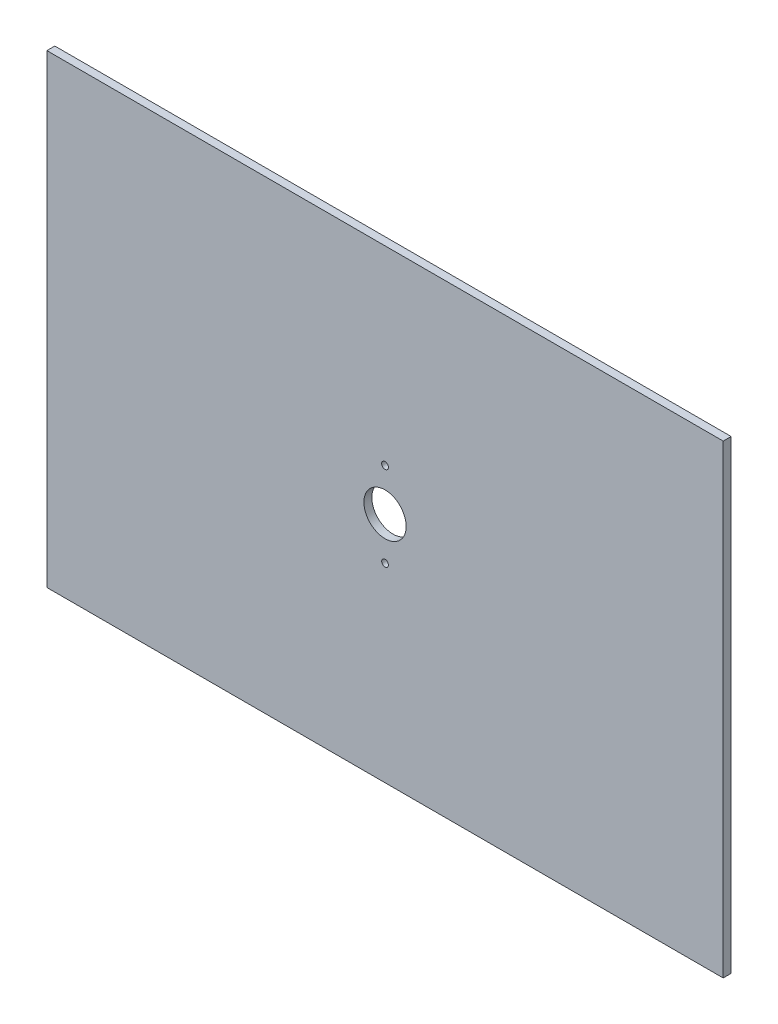
ISO-10303-21;
HEADER;
FILE_DESCRIPTION(('STEP AP214'),'2;1');
FILE_NAME('part.step','',(''),(''),'','','');
FILE_SCHEMA(('AUTOMOTIVE_DESIGN { 1 0 10303 214 1 1 1 1 }'));
ENDSEC;
DATA;
#1=APPLICATION_CONTEXT('core data for automotive mechanical design processes');
#2=APPLICATION_PROTOCOL_DEFINITION('international standard','automotive_design',2000,#1);
#3=PRODUCT_CONTEXT('',#1,'mechanical');
#4=PRODUCT('Part','Part','',(#3));
#5=PRODUCT_RELATED_PRODUCT_CATEGORY('part','',(#4));
#6=PRODUCT_DEFINITION_FORMATION('','',#4);
#7=PRODUCT_DEFINITION_CONTEXT('part definition',#1,'design');
#8=PRODUCT_DEFINITION('design','',#6,#7);
#9=PRODUCT_DEFINITION_SHAPE('','',#8);
#10=(LENGTH_UNIT() NAMED_UNIT(*) SI_UNIT(.MILLI.,.METRE.));
#11=(NAMED_UNIT(*) PLANE_ANGLE_UNIT() SI_UNIT($,.RADIAN.));
#12=(NAMED_UNIT(*) SI_UNIT($,.STERADIAN.) SOLID_ANGLE_UNIT());
#13=UNCERTAINTY_MEASURE_WITH_UNIT(LENGTH_MEASURE(1.E-05),#10,'distance_accuracy_value','');
#14=(GEOMETRIC_REPRESENTATION_CONTEXT(3) GLOBAL_UNCERTAINTY_ASSIGNED_CONTEXT((#13)) GLOBAL_UNIT_ASSIGNED_CONTEXT((#10,
#11,#12)) REPRESENTATION_CONTEXT('',''));
#15=CARTESIAN_POINT('',(0.,0.,0.));
#16=DIRECTION('',(0.,0.,1.));
#17=DIRECTION('',(1.,0.,0.));
#18=AXIS2_PLACEMENT_3D('',#15,#16,#17);
#19=CARTESIAN_POINT('',(0.,0.,4.7625));
#20=DIRECTION('',(-1.,0.,0.));
#21=DIRECTION('',(0.,0.,1.));
#22=AXIS2_PLACEMENT_3D('',#19,#20,#21);
#23=PLANE('',#22);
#24=DIRECTION('',(0.,1.,0.));
#25=VECTOR('',#24,1.);
#26=CARTESIAN_POINT('',(0.,0.,0.));
#27=LINE('',#26,#25);
#28=CARTESIAN_POINT('',(0.,0.,0.));
#29=VERTEX_POINT('',#28);
#30=CARTESIAN_POINT('',(0.,279.4,0.));
#31=VERTEX_POINT('',#30);
#32=EDGE_CURVE('E106',#29,#31,#27,.T.);
#33=ORIENTED_EDGE('',*,*,#32,.T.);
#34=DIRECTION('',(0.,0.,-1.));
#35=VECTOR('',#34,1.);
#36=CARTESIAN_POINT('',(0.,279.4,4.7625));
#37=LINE('',#36,#35);
#38=CARTESIAN_POINT('',(0.,279.4,4.7625));
#39=VERTEX_POINT('',#38);
#40=EDGE_CURVE('E11',#39,#31,#37,.T.);
#41=ORIENTED_EDGE('',*,*,#40,.F.);
#42=DIRECTION('',(0.,1.,0.));
#43=VECTOR('',#42,1.);
#44=CARTESIAN_POINT('',(0.,0.,4.7625));
#45=LINE('',#44,#43);
#46=CARTESIAN_POINT('',(0.,0.,4.7625));
#47=VERTEX_POINT('',#46);
#48=EDGE_CURVE('E90',#47,#39,#45,.T.);
#49=ORIENTED_EDGE('',*,*,#48,.F.);
#50=DIRECTION('',(0.,0.,-1.));
#51=VECTOR('',#50,1.);
#52=CARTESIAN_POINT('',(0.,0.,4.7625));
#53=LINE('',#52,#51);
#54=EDGE_CURVE('E102',#47,#29,#53,.T.);
#55=ORIENTED_EDGE('',*,*,#54,.T.);
#56=EDGE_LOOP('',(#33,#41,#49,#55));
#57=FACE_BOUND('',#56,.T.);
#58=ADVANCED_FACE('F38',(#57),#23,.F.);
#59=CARTESIAN_POINT('',(0.,279.4,4.7625));
#60=DIRECTION('',(0.,-1.,0.));
#61=DIRECTION('',(1.,0.,0.));
#62=AXIS2_PLACEMENT_3D('',#59,#60,#61);
#63=PLANE('',#62);
#64=DIRECTION('',(-1.,0.,0.));
#65=VECTOR('',#64,1.);
#66=CARTESIAN_POINT('',(0.,279.4,0.));
#67=LINE('',#66,#65);
#68=CARTESIAN_POINT('',(-406.4,279.4,0.));
#69=VERTEX_POINT('',#68);
#70=EDGE_CURVE('E95',#31,#69,#67,.T.);
#71=ORIENTED_EDGE('',*,*,#70,.T.);
#72=DIRECTION('',(0.,0.,-1.));
#73=VECTOR('',#72,1.);
#74=CARTESIAN_POINT('',(-406.4,279.4,4.7625));
#75=LINE('',#74,#73);
#76=CARTESIAN_POINT('',(-406.4,279.4,4.7625));
#77=VERTEX_POINT('',#76);
#78=EDGE_CURVE('E47',#77,#69,#75,.T.);
#79=ORIENTED_EDGE('',*,*,#78,.F.);
#80=DIRECTION('',(-1.,0.,0.));
#81=VECTOR('',#80,1.);
#82=CARTESIAN_POINT('',(0.,279.4,4.7625));
#83=LINE('',#82,#81);
#84=EDGE_CURVE('E85',#39,#77,#83,.T.);
#85=ORIENTED_EDGE('',*,*,#84,.F.);
#86=ORIENTED_EDGE('',*,*,#40,.T.);
#87=EDGE_LOOP('',(#71,#79,#85,#86));
#88=FACE_BOUND('',#87,.T.);
#89=ADVANCED_FACE('F94',(#88),#63,.F.);
#90=CARTESIAN_POINT('',(-406.4,0.,4.7625));
#91=DIRECTION('',(1.,0.,0.));
#92=DIRECTION('',(0.,0.,-1.));
#93=AXIS2_PLACEMENT_3D('',#90,#91,#92);
#94=PLANE('',#93);
#95=DIRECTION('',(0.,-1.,0.));
#96=VECTOR('',#95,1.);
#97=CARTESIAN_POINT('',(-406.4,0.,0.));
#98=LINE('',#97,#96);
#99=CARTESIAN_POINT('',(-406.4,0.,0.));
#100=VERTEX_POINT('',#99);
#101=EDGE_CURVE('E72',#69,#100,#98,.T.);
#102=ORIENTED_EDGE('',*,*,#101,.T.);
#103=DIRECTION('',(0.,0.,-1.));
#104=VECTOR('',#103,1.);
#105=CARTESIAN_POINT('',(-406.4,0.,4.7625));
#106=LINE('',#105,#104);
#107=CARTESIAN_POINT('',(-406.4,0.,4.7625));
#108=VERTEX_POINT('',#107);
#109=EDGE_CURVE('E97',#108,#100,#106,.T.);
#110=ORIENTED_EDGE('',*,*,#109,.F.);
#111=DIRECTION('',(0.,-1.,0.));
#112=VECTOR('',#111,1.);
#113=CARTESIAN_POINT('',(-406.4,0.,4.7625));
#114=LINE('',#113,#112);
#115=EDGE_CURVE('E88',#77,#108,#114,.T.);
#116=ORIENTED_EDGE('',*,*,#115,.F.);
#117=ORIENTED_EDGE('',*,*,#78,.T.);
#118=EDGE_LOOP('',(#102,#110,#116,#117));
#119=FACE_BOUND('',#118,.T.);
#120=ADVANCED_FACE('F98',(#119),#94,.F.);
#121=CARTESIAN_POINT('',(0.,0.,4.7625));
#122=DIRECTION('',(0.,1.,0.));
#123=DIRECTION('',(-1.,0.,0.));
#124=AXIS2_PLACEMENT_3D('',#121,#122,#123);
#125=PLANE('',#124);
#126=DIRECTION('',(1.,0.,0.));
#127=VECTOR('',#126,1.);
#128=CARTESIAN_POINT('',(0.,0.,0.));
#129=LINE('',#128,#127);
#130=EDGE_CURVE('E78',#100,#29,#129,.T.);
#131=ORIENTED_EDGE('',*,*,#130,.T.);
#132=ORIENTED_EDGE('',*,*,#54,.F.);
#133=DIRECTION('',(1.,0.,0.));
#134=VECTOR('',#133,1.);
#135=CARTESIAN_POINT('',(0.,0.,4.7625));
#136=LINE('',#135,#134);
#137=EDGE_CURVE('E55',#108,#47,#136,.T.);
#138=ORIENTED_EDGE('',*,*,#137,.F.);
#139=ORIENTED_EDGE('',*,*,#109,.T.);
#140=EDGE_LOOP('',(#131,#132,#138,#139));
#141=FACE_BOUND('',#140,.T.);
#142=ADVANCED_FACE('F120',(#141),#125,.F.);
#143=CARTESIAN_POINT('',(0.,0.,4.7625));
#144=DIRECTION('',(0.,0.,1.));
#145=DIRECTION('',(1.,0.,0.));
#146=AXIS2_PLACEMENT_3D('',#143,#144,#145);
#147=PLANE('',#146);
#148=CARTESIAN_POINT('',(-203.2,114.3,4.7625));
#149=DIRECTION('',(0.,0.,1.));
#150=DIRECTION('',(1.,0.,0.));
#151=AXIS2_PLACEMENT_3D('',#148,#149,#150);
#152=CIRCLE('',#151,2.03200000000001);
#153=CARTESIAN_POINT('',(-201.168,114.3,4.7625));
#154=VERTEX_POINT('',#153);
#155=EDGE_CURVE('E134',#154,#154,#152,.F.);
#156=ORIENTED_EDGE('',*,*,#155,.T.);
#157=EDGE_LOOP('',(#156));
#158=FACE_BOUND('',#157,.T.);
#159=CARTESIAN_POINT('',(-203.2,165.1,4.7625));
#160=DIRECTION('',(0.,0.,1.));
#161=DIRECTION('',(1.,0.,0.));
#162=AXIS2_PLACEMENT_3D('',#159,#160,#161);
#163=CIRCLE('',#162,2.032);
#164=CARTESIAN_POINT('',(-201.168,165.1,4.7625));
#165=VERTEX_POINT('',#164);
#166=EDGE_CURVE('E135',#165,#165,#163,.F.);
#167=ORIENTED_EDGE('',*,*,#166,.T.);
#168=EDGE_LOOP('',(#167));
#169=FACE_BOUND('',#168,.T.);
#170=CARTESIAN_POINT('',(-203.2,139.7,4.7625));
#171=DIRECTION('',(0.,0.,1.));
#172=DIRECTION('',(1.,0.,0.));
#173=AXIS2_PLACEMENT_3D('',#170,#171,#172);
#174=CIRCLE('',#173,12.7);
#175=CARTESIAN_POINT('',(-190.5,139.7,4.7625));
#176=VERTEX_POINT('',#175);
#177=EDGE_CURVE('E130',#176,#176,#174,.T.);
#178=ORIENTED_EDGE('',*,*,#177,.F.);
#179=EDGE_LOOP('',(#178));
#180=FACE_BOUND('',#179,.T.);
#181=ORIENTED_EDGE('',*,*,#48,.T.);
#182=ORIENTED_EDGE('',*,*,#84,.T.);
#183=ORIENTED_EDGE('',*,*,#115,.T.);
#184=ORIENTED_EDGE('',*,*,#137,.T.);
#185=EDGE_LOOP('',(#181,#182,#183,#184));
#186=FACE_BOUND('',#185,.T.);
#187=ADVANCED_FACE('F86',(#158,#169,#180,#186),#147,.T.);
#188=CARTESIAN_POINT('',(0.,0.,0.));
#189=DIRECTION('',(0.,0.,1.));
#190=DIRECTION('',(1.,0.,0.));
#191=AXIS2_PLACEMENT_3D('',#188,#189,#190);
#192=PLANE('',#191);
#193=CARTESIAN_POINT('',(-203.2,114.3,0.));
#194=DIRECTION('',(0.,0.,-1.));
#195=DIRECTION('',(-1.,0.,0.));
#196=AXIS2_PLACEMENT_3D('',#193,#194,#195);
#197=CIRCLE('',#196,2.03200000000001);
#198=CARTESIAN_POINT('',(-205.232,114.3,0.));
#199=VERTEX_POINT('',#198);
#200=EDGE_CURVE('E139',#199,#199,#197,.T.);
#201=ORIENTED_EDGE('',*,*,#200,.F.);
#202=EDGE_LOOP('',(#201));
#203=FACE_BOUND('',#202,.T.);
#204=CARTESIAN_POINT('',(-203.2,165.1,0.));
#205=DIRECTION('',(0.,0.,-1.));
#206=DIRECTION('',(-1.,0.,0.));
#207=AXIS2_PLACEMENT_3D('',#204,#205,#206);
#208=CIRCLE('',#207,2.032);
#209=CARTESIAN_POINT('',(-205.232,165.1,0.));
#210=VERTEX_POINT('',#209);
#211=EDGE_CURVE('E140',#210,#210,#208,.T.);
#212=ORIENTED_EDGE('',*,*,#211,.F.);
#213=EDGE_LOOP('',(#212));
#214=FACE_BOUND('',#213,.T.);
#215=CARTESIAN_POINT('',(-203.2,139.7,0.));
#216=DIRECTION('',(0.,0.,1.));
#217=DIRECTION('',(1.,0.,0.));
#218=AXIS2_PLACEMENT_3D('',#215,#216,#217);
#219=CIRCLE('',#218,12.7);
#220=CARTESIAN_POINT('',(-190.5,139.7,0.));
#221=VERTEX_POINT('',#220);
#222=EDGE_CURVE('E110',#221,#221,#219,.F.);
#223=ORIENTED_EDGE('',*,*,#222,.F.);
#224=EDGE_LOOP('',(#223));
#225=FACE_BOUND('',#224,.T.);
#226=ORIENTED_EDGE('',*,*,#32,.F.);
#227=ORIENTED_EDGE('',*,*,#130,.F.);
#228=ORIENTED_EDGE('',*,*,#101,.F.);
#229=ORIENTED_EDGE('',*,*,#70,.F.);
#230=EDGE_LOOP('',(#226,#227,#228,#229));
#231=FACE_BOUND('',#230,.T.);
#232=ADVANCED_FACE('F123',(#203,#214,#225,#231),#192,.F.);
#233=CARTESIAN_POINT('',(-203.2,139.7,-35.9210244842766));
#234=DIRECTION('',(0.,0.,1.));
#235=DIRECTION('',(1.,0.,0.));
#236=AXIS2_PLACEMENT_3D('',#233,#234,#235);
#237=CYLINDRICAL_SURFACE('',#236,12.7);
#238=ORIENTED_EDGE('',*,*,#222,.T.);
#239=EDGE_LOOP('',(#238));
#240=FACE_BOUND('',#239,.T.);
#241=ORIENTED_EDGE('',*,*,#177,.T.);
#242=EDGE_LOOP('',(#241));
#243=FACE_BOUND('',#242,.T.);
#244=ADVANCED_FACE('F156',(#240,#243),#237,.F.);
#245=CARTESIAN_POINT('',(-203.2,165.1,10.5098639174843));
#246=DIRECTION('',(0.,0.,-1.));
#247=DIRECTION('',(-1.,0.,0.));
#248=AXIS2_PLACEMENT_3D('',#245,#246,#247);
#249=CYLINDRICAL_SURFACE('',#248,2.032);
#250=ORIENTED_EDGE('',*,*,#211,.T.);
#251=EDGE_LOOP('',(#250));
#252=FACE_BOUND('',#251,.T.);
#253=ORIENTED_EDGE('',*,*,#166,.F.);
#254=EDGE_LOOP('',(#253));
#255=FACE_BOUND('',#254,.T.);
#256=ADVANCED_FACE('F164',(#252,#255),#249,.F.);
#257=CARTESIAN_POINT('',(-203.2,114.3,10.5098639174843));
#258=DIRECTION('',(0.,0.,-1.));
#259=DIRECTION('',(-1.,0.,0.));
#260=AXIS2_PLACEMENT_3D('',#257,#258,#259);
#261=CYLINDRICAL_SURFACE('',#260,2.03200000000001);
#262=ORIENTED_EDGE('',*,*,#200,.T.);
#263=EDGE_LOOP('',(#262));
#264=FACE_BOUND('',#263,.T.);
#265=ORIENTED_EDGE('',*,*,#155,.F.);
#266=EDGE_LOOP('',(#265));
#267=FACE_BOUND('',#266,.T.);
#268=ADVANCED_FACE('F151',(#264,#267),#261,.F.);
#269=CLOSED_SHELL('',(#58,#89,#120,#142,#187,#232,#244,#256,#268));
#270=MANIFOLD_SOLID_BREP('B2',#269);
#271=ADVANCED_BREP_SHAPE_REPRESENTATION('',(#18,#270),#14);
#272=SHAPE_DEFINITION_REPRESENTATION(#9,#271);
ENDSEC;
END-ISO-10303-21;
